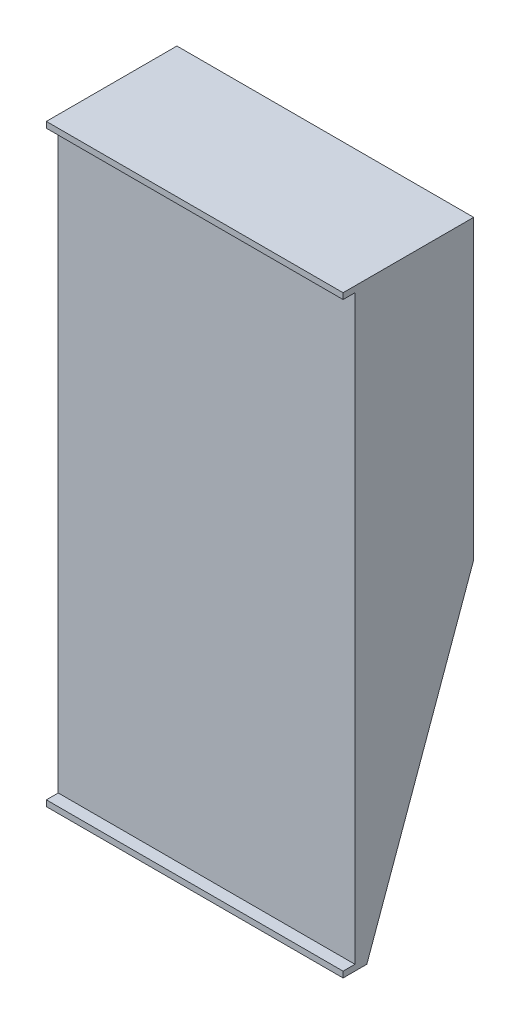
ISO-10303-21;
HEADER;
FILE_DESCRIPTION(('STEP AP214'),'2;1');
FILE_NAME('part.step','',(''),(''),'','','');
FILE_SCHEMA(('AUTOMOTIVE_DESIGN { 1 0 10303 214 1 1 1 1 }'));
ENDSEC;
DATA;
#1=APPLICATION_CONTEXT('core data for automotive mechanical design processes');
#2=APPLICATION_PROTOCOL_DEFINITION('international standard','automotive_design',2000,#1);
#3=PRODUCT_CONTEXT('',#1,'mechanical');
#4=PRODUCT('Part','Part','',(#3));
#5=PRODUCT_RELATED_PRODUCT_CATEGORY('part','',(#4));
#6=PRODUCT_DEFINITION_FORMATION('','',#4);
#7=PRODUCT_DEFINITION_CONTEXT('part definition',#1,'design');
#8=PRODUCT_DEFINITION('design','',#6,#7);
#9=PRODUCT_DEFINITION_SHAPE('','',#8);
#10=(LENGTH_UNIT() NAMED_UNIT(*) SI_UNIT(.MILLI.,.METRE.));
#11=(NAMED_UNIT(*) PLANE_ANGLE_UNIT() SI_UNIT($,.RADIAN.));
#12=(NAMED_UNIT(*) SI_UNIT($,.STERADIAN.) SOLID_ANGLE_UNIT());
#13=UNCERTAINTY_MEASURE_WITH_UNIT(LENGTH_MEASURE(1.E-05),#10,'distance_accuracy_value','');
#14=(GEOMETRIC_REPRESENTATION_CONTEXT(3) GLOBAL_UNCERTAINTY_ASSIGNED_CONTEXT((#13)) GLOBAL_UNIT_ASSIGNED_CONTEXT((#10,
#11,#12)) REPRESENTATION_CONTEXT('',''));
#15=CARTESIAN_POINT('',(0.,0.,0.));
#16=DIRECTION('',(0.,0.,1.));
#17=DIRECTION('',(1.,0.,0.));
#18=AXIS2_PLACEMENT_3D('',#15,#16,#17);
#19=CARTESIAN_POINT('',(0.,0.,2.54));
#20=DIRECTION('',(0.,0.,-1.));
#21=DIRECTION('',(-1.,0.,0.));
#22=AXIS2_PLACEMENT_3D('',#19,#20,#21);
#23=PLANE('',#22);
#24=DIRECTION('',(0.,1.,0.));
#25=VECTOR('',#24,1.);
#26=CARTESIAN_POINT('',(3.175,-6.35,2.54));
#27=LINE('',#26,#25);
#28=CARTESIAN_POINT('',(3.175,-6.223,2.54));
#29=VERTEX_POINT('',#28);
#30=CARTESIAN_POINT('',(3.175,6.223,2.54));
#31=VERTEX_POINT('',#30);
#32=EDGE_CURVE('E56',#29,#31,#27,.T.);
#33=ORIENTED_EDGE('',*,*,#32,.T.);
#34=DIRECTION('',(-1.,0.,0.));
#35=VECTOR('',#34,1.);
#36=CARTESIAN_POINT('',(-3.175,6.223,2.54));
#37=LINE('',#36,#35);
#38=CARTESIAN_POINT('',(-3.175,6.223,2.54));
#39=VERTEX_POINT('',#38);
#40=EDGE_CURVE('E110',#31,#39,#37,.T.);
#41=ORIENTED_EDGE('',*,*,#40,.T.);
#42=DIRECTION('',(0.,-1.,0.));
#43=VECTOR('',#42,1.);
#44=CARTESIAN_POINT('',(-3.175,-6.35,2.54));
#45=LINE('',#44,#43);
#46=CARTESIAN_POINT('',(-3.175,-6.223,2.54));
#47=VERTEX_POINT('',#46);
#48=EDGE_CURVE('E129',#39,#47,#45,.T.);
#49=ORIENTED_EDGE('',*,*,#48,.T.);
#50=DIRECTION('',(-1.,0.,0.));
#51=VECTOR('',#50,1.);
#52=CARTESIAN_POINT('',(-3.175,-6.223,2.54));
#53=LINE('',#52,#51);
#54=EDGE_CURVE('E146',#29,#47,#53,.T.);
#55=ORIENTED_EDGE('',*,*,#54,.F.);
#56=EDGE_LOOP('',(#33,#41,#49,#55));
#57=FACE_BOUND('',#56,.T.);
#58=ADVANCED_FACE('F33',(#57),#23,.F.);
#59=CARTESIAN_POINT('',(3.175,-6.35,2.54));
#60=DIRECTION('',(-1.,0.,0.));
#61=DIRECTION('',(0.,0.,1.));
#62=AXIS2_PLACEMENT_3D('',#59,#60,#61);
#63=PLANE('',#62);
#64=DIRECTION('',(0.,0.,-1.));
#65=VECTOR('',#64,1.);
#66=CARTESIAN_POINT('',(3.175,-6.35,2.54));
#67=LINE('',#66,#65);
#68=CARTESIAN_POINT('',(3.175,-6.35,2.794));
#69=VERTEX_POINT('',#68);
#70=CARTESIAN_POINT('',(3.175,-6.35,2.286));
#71=VERTEX_POINT('',#70);
#72=EDGE_CURVE('E127',#69,#71,#67,.T.);
#73=ORIENTED_EDGE('',*,*,#72,.T.);
#74=DIRECTION('',(0.,-0.940887411868727,0.338719468272742));
#75=VECTOR('',#74,1.);
#76=CARTESIAN_POINT('',(3.175,-6.35,2.286));
#77=LINE('',#76,#75);
#78=CARTESIAN_POINT('',(3.175,0.,0.));
#79=VERTEX_POINT('',#78);
#80=EDGE_CURVE('E106',#79,#71,#77,.T.);
#81=ORIENTED_EDGE('',*,*,#80,.F.);
#82=DIRECTION('',(0.,1.,0.));
#83=VECTOR('',#82,1.);
#84=CARTESIAN_POINT('',(3.175,-6.35,0.));
#85=LINE('',#84,#83);
#86=CARTESIAN_POINT('',(3.175,6.35,0.));
#87=VERTEX_POINT('',#86);
#88=EDGE_CURVE('E135',#79,#87,#85,.T.);
#89=ORIENTED_EDGE('',*,*,#88,.T.);
#90=DIRECTION('',(0.,0.,-1.));
#91=VECTOR('',#90,1.);
#92=CARTESIAN_POINT('',(3.175,6.35,2.54));
#93=LINE('',#92,#91);
#94=CARTESIAN_POINT('',(3.175,6.35,2.794));
#95=VERTEX_POINT('',#94);
#96=EDGE_CURVE('E11',#95,#87,#93,.T.);
#97=ORIENTED_EDGE('',*,*,#96,.F.);
#98=DIRECTION('',(0.,-1.,0.));
#99=VECTOR('',#98,1.);
#100=CARTESIAN_POINT('',(3.175,6.35,2.794));
#101=LINE('',#100,#99);
#102=CARTESIAN_POINT('',(3.175,6.223,2.794));
#103=VERTEX_POINT('',#102);
#104=EDGE_CURVE('E165',#95,#103,#101,.T.);
#105=ORIENTED_EDGE('',*,*,#104,.T.);
#106=DIRECTION('',(0.,0.,-1.));
#107=VECTOR('',#106,1.);
#108=CARTESIAN_POINT('',(3.175,6.223,2.794));
#109=LINE('',#108,#107);
#110=EDGE_CURVE('E158',#103,#31,#109,.T.);
#111=ORIENTED_EDGE('',*,*,#110,.T.);
#112=ORIENTED_EDGE('',*,*,#32,.F.);
#113=DIRECTION('',(0.,0.,-1.));
#114=VECTOR('',#113,1.);
#115=CARTESIAN_POINT('',(3.175,-6.223,2.794));
#116=LINE('',#115,#114);
#117=CARTESIAN_POINT('',(3.175,-6.223,2.794));
#118=VERTEX_POINT('',#117);
#119=EDGE_CURVE('E137',#118,#29,#116,.T.);
#120=ORIENTED_EDGE('',*,*,#119,.F.);
#121=DIRECTION('',(0.,1.,0.));
#122=VECTOR('',#121,1.);
#123=CARTESIAN_POINT('',(3.175,-6.35,2.794));
#124=LINE('',#123,#122);
#125=EDGE_CURVE('E152',#69,#118,#124,.T.);
#126=ORIENTED_EDGE('',*,*,#125,.F.);
#127=EDGE_LOOP('',(#73,#81,#89,#97,#105,#111,#112,#120,#126));
#128=FACE_BOUND('',#127,.T.);
#129=ADVANCED_FACE('F35',(#128),#63,.F.);
#130=CARTESIAN_POINT('',(-3.175,6.35,2.54));
#131=DIRECTION('',(0.,-1.,0.));
#132=DIRECTION('',(0.,0.,-1.));
#133=AXIS2_PLACEMENT_3D('',#130,#131,#132);
#134=PLANE('',#133);
#135=DIRECTION('',(-1.,0.,0.));
#136=VECTOR('',#135,1.);
#137=CARTESIAN_POINT('',(-3.175,6.35,0.));
#138=LINE('',#137,#136);
#139=CARTESIAN_POINT('',(-3.175,6.35,0.));
#140=VERTEX_POINT('',#139);
#141=EDGE_CURVE('E133',#87,#140,#138,.T.);
#142=ORIENTED_EDGE('',*,*,#141,.T.);
#143=DIRECTION('',(0.,0.,-1.));
#144=VECTOR('',#143,1.);
#145=CARTESIAN_POINT('',(-3.175,6.35,2.54));
#146=LINE('',#145,#144);
#147=CARTESIAN_POINT('',(-3.175,6.35,2.794));
#148=VERTEX_POINT('',#147);
#149=EDGE_CURVE('E41',#148,#140,#146,.T.);
#150=ORIENTED_EDGE('',*,*,#149,.F.);
#151=DIRECTION('',(1.,0.,0.));
#152=VECTOR('',#151,1.);
#153=CARTESIAN_POINT('',(-3.175,6.35,2.794));
#154=LINE('',#153,#152);
#155=EDGE_CURVE('E160',#148,#95,#154,.T.);
#156=ORIENTED_EDGE('',*,*,#155,.T.);
#157=ORIENTED_EDGE('',*,*,#96,.T.);
#158=EDGE_LOOP('',(#142,#150,#156,#157));
#159=FACE_BOUND('',#158,.T.);
#160=ADVANCED_FACE('F181',(#159),#134,.F.);
#161=CARTESIAN_POINT('',(-3.175,-6.35,2.54));
#162=DIRECTION('',(1.,0.,0.));
#163=DIRECTION('',(0.,0.,-1.));
#164=AXIS2_PLACEMENT_3D('',#161,#162,#163);
#165=PLANE('',#164);
#166=DIRECTION('',(0.,-1.,0.));
#167=VECTOR('',#166,1.);
#168=CARTESIAN_POINT('',(-3.175,-6.35,0.));
#169=LINE('',#168,#167);
#170=CARTESIAN_POINT('',(-3.175,0.,0.));
#171=VERTEX_POINT('',#170);
#172=EDGE_CURVE('E121',#140,#171,#169,.T.);
#173=ORIENTED_EDGE('',*,*,#172,.T.);
#174=DIRECTION('',(0.,-0.940887411868727,0.338719468272742));
#175=VECTOR('',#174,1.);
#176=CARTESIAN_POINT('',(-3.175,-6.35,2.286));
#177=LINE('',#176,#175);
#178=CARTESIAN_POINT('',(-3.175,-6.35,2.286));
#179=VERTEX_POINT('',#178);
#180=EDGE_CURVE('E48',#171,#179,#177,.T.);
#181=ORIENTED_EDGE('',*,*,#180,.T.);
#182=DIRECTION('',(0.,0.,-1.));
#183=VECTOR('',#182,1.);
#184=CARTESIAN_POINT('',(-3.175,-6.35,2.54));
#185=LINE('',#184,#183);
#186=CARTESIAN_POINT('',(-3.175,-6.35,2.794));
#187=VERTEX_POINT('',#186);
#188=EDGE_CURVE('E117',#187,#179,#185,.T.);
#189=ORIENTED_EDGE('',*,*,#188,.F.);
#190=DIRECTION('',(0.,-1.,0.));
#191=VECTOR('',#190,1.);
#192=CARTESIAN_POINT('',(-3.175,-6.35,2.794));
#193=LINE('',#192,#191);
#194=CARTESIAN_POINT('',(-3.175,-6.223,2.794));
#195=VERTEX_POINT('',#194);
#196=EDGE_CURVE('E149',#195,#187,#193,.T.);
#197=ORIENTED_EDGE('',*,*,#196,.F.);
#198=DIRECTION('',(0.,0.,-1.));
#199=VECTOR('',#198,1.);
#200=CARTESIAN_POINT('',(-3.175,-6.223,2.794));
#201=LINE('',#200,#199);
#202=EDGE_CURVE('E142',#195,#47,#201,.T.);
#203=ORIENTED_EDGE('',*,*,#202,.T.);
#204=ORIENTED_EDGE('',*,*,#48,.F.);
#205=DIRECTION('',(0.,0.,-1.));
#206=VECTOR('',#205,1.);
#207=CARTESIAN_POINT('',(-3.175,6.223,2.794));
#208=LINE('',#207,#206);
#209=CARTESIAN_POINT('',(-3.175,6.223,2.794));
#210=VERTEX_POINT('',#209);
#211=EDGE_CURVE('E150',#210,#39,#208,.T.);
#212=ORIENTED_EDGE('',*,*,#211,.F.);
#213=DIRECTION('',(0.,1.,0.));
#214=VECTOR('',#213,1.);
#215=CARTESIAN_POINT('',(-3.175,6.35,2.794));
#216=LINE('',#215,#214);
#217=EDGE_CURVE('E162',#210,#148,#216,.T.);
#218=ORIENTED_EDGE('',*,*,#217,.T.);
#219=ORIENTED_EDGE('',*,*,#149,.T.);
#220=EDGE_LOOP('',(#173,#181,#189,#197,#203,#204,#212,#218,#219));
#221=FACE_BOUND('',#220,.T.);
#222=ADVANCED_FACE('F115',(#221),#165,.F.);
#223=CARTESIAN_POINT('',(-3.175,-6.35,2.54));
#224=DIRECTION('',(0.,1.,0.));
#225=DIRECTION('',(0.,0.,1.));
#226=AXIS2_PLACEMENT_3D('',#223,#224,#225);
#227=PLANE('',#226);
#228=ORIENTED_EDGE('',*,*,#188,.T.);
#229=DIRECTION('',(1.,0.,0.));
#230=VECTOR('',#229,1.);
#231=CARTESIAN_POINT('',(-3.175,-6.35,2.286));
#232=LINE('',#231,#230);
#233=EDGE_CURVE('E103',#179,#71,#232,.T.);
#234=ORIENTED_EDGE('',*,*,#233,.T.);
#235=ORIENTED_EDGE('',*,*,#72,.F.);
#236=DIRECTION('',(1.,0.,0.));
#237=VECTOR('',#236,1.);
#238=CARTESIAN_POINT('',(-3.175,-6.35,2.794));
#239=LINE('',#238,#237);
#240=EDGE_CURVE('E125',#187,#69,#239,.T.);
#241=ORIENTED_EDGE('',*,*,#240,.F.);
#242=EDGE_LOOP('',(#228,#234,#235,#241));
#243=FACE_BOUND('',#242,.T.);
#244=ADVANCED_FACE('F123',(#243),#227,.F.);
#245=CARTESIAN_POINT('',(0.,0.,0.));
#246=DIRECTION('',(0.,0.,-1.));
#247=DIRECTION('',(-1.,0.,0.));
#248=AXIS2_PLACEMENT_3D('',#245,#246,#247);
#249=PLANE('',#248);
#250=DIRECTION('',(1.,0.,0.));
#251=VECTOR('',#250,1.);
#252=CARTESIAN_POINT('',(-3.175,0.,0.));
#253=LINE('',#252,#251);
#254=EDGE_CURVE('E111',#171,#79,#253,.T.);
#255=ORIENTED_EDGE('',*,*,#254,.F.);
#256=ORIENTED_EDGE('',*,*,#172,.F.);
#257=ORIENTED_EDGE('',*,*,#141,.F.);
#258=ORIENTED_EDGE('',*,*,#88,.F.);
#259=EDGE_LOOP('',(#255,#256,#257,#258));
#260=FACE_BOUND('',#259,.T.);
#261=ADVANCED_FACE('F179',(#260),#249,.T.);
#262=CARTESIAN_POINT('',(-3.175,-6.223,2.794));
#263=DIRECTION('',(0.,-1.,0.));
#264=DIRECTION('',(0.,0.,-1.));
#265=AXIS2_PLACEMENT_3D('',#262,#263,#264);
#266=PLANE('',#265);
#267=ORIENTED_EDGE('',*,*,#54,.T.);
#268=ORIENTED_EDGE('',*,*,#202,.F.);
#269=DIRECTION('',(-1.,0.,0.));
#270=VECTOR('',#269,1.);
#271=CARTESIAN_POINT('',(-3.175,-6.223,2.794));
#272=LINE('',#271,#270);
#273=EDGE_CURVE('E145',#118,#195,#272,.T.);
#274=ORIENTED_EDGE('',*,*,#273,.F.);
#275=ORIENTED_EDGE('',*,*,#119,.T.);
#276=EDGE_LOOP('',(#267,#268,#274,#275));
#277=FACE_BOUND('',#276,.T.);
#278=ADVANCED_FACE('F194',(#277),#266,.F.);
#279=CARTESIAN_POINT('',(0.,0.,2.794));
#280=DIRECTION('',(0.,0.,-1.));
#281=DIRECTION('',(-1.,0.,0.));
#282=AXIS2_PLACEMENT_3D('',#279,#280,#281);
#283=PLANE('',#282);
#284=ORIENTED_EDGE('',*,*,#196,.T.);
#285=ORIENTED_EDGE('',*,*,#240,.T.);
#286=ORIENTED_EDGE('',*,*,#125,.T.);
#287=ORIENTED_EDGE('',*,*,#273,.T.);
#288=EDGE_LOOP('',(#284,#285,#286,#287));
#289=FACE_BOUND('',#288,.T.);
#290=ADVANCED_FACE('F197',(#289),#283,.F.);
#291=CARTESIAN_POINT('',(-3.175,6.223,2.794));
#292=DIRECTION('',(0.,-1.,0.));
#293=DIRECTION('',(0.,0.,-1.));
#294=AXIS2_PLACEMENT_3D('',#291,#292,#293);
#295=PLANE('',#294);
#296=ORIENTED_EDGE('',*,*,#40,.F.);
#297=ORIENTED_EDGE('',*,*,#110,.F.);
#298=DIRECTION('',(-1.,0.,0.));
#299=VECTOR('',#298,1.);
#300=CARTESIAN_POINT('',(-3.175,6.223,2.794));
#301=LINE('',#300,#299);
#302=EDGE_CURVE('E168',#103,#210,#301,.T.);
#303=ORIENTED_EDGE('',*,*,#302,.T.);
#304=ORIENTED_EDGE('',*,*,#211,.T.);
#305=EDGE_LOOP('',(#296,#297,#303,#304));
#306=FACE_BOUND('',#305,.T.);
#307=ADVANCED_FACE('F190',(#306),#295,.T.);
#308=CARTESIAN_POINT('',(0.,0.,2.794));
#309=DIRECTION('',(0.,0.,-1.));
#310=DIRECTION('',(-1.,0.,0.));
#311=AXIS2_PLACEMENT_3D('',#308,#309,#310);
#312=PLANE('',#311);
#313=ORIENTED_EDGE('',*,*,#217,.F.);
#314=ORIENTED_EDGE('',*,*,#302,.F.);
#315=ORIENTED_EDGE('',*,*,#104,.F.);
#316=ORIENTED_EDGE('',*,*,#155,.F.);
#317=EDGE_LOOP('',(#313,#314,#315,#316));
#318=FACE_BOUND('',#317,.T.);
#319=ADVANCED_FACE('F187',(#318),#312,.F.);
#320=CARTESIAN_POINT('',(-3.175,-6.35,2.286));
#321=DIRECTION('',(0.,0.338719468272742,0.940887411868727));
#322=DIRECTION('',(0.,-0.940887411868727,0.338719468272742));
#323=AXIS2_PLACEMENT_3D('',#320,#321,#322);
#324=PLANE('',#323);
#325=ORIENTED_EDGE('',*,*,#80,.T.);
#326=ORIENTED_EDGE('',*,*,#233,.F.);
#327=ORIENTED_EDGE('',*,*,#180,.F.);
#328=ORIENTED_EDGE('',*,*,#254,.T.);
#329=EDGE_LOOP('',(#325,#326,#327,#328));
#330=FACE_BOUND('',#329,.T.);
#331=ADVANCED_FACE('F104',(#330),#324,.F.);
#332=CLOSED_SHELL('',(#58,#129,#160,#222,#244,#261,#278,#290,#307,#319,#331));
#333=MANIFOLD_SOLID_BREP('B2',#332);
#334=ADVANCED_BREP_SHAPE_REPRESENTATION('',(#18,#333),#14);
#335=SHAPE_DEFINITION_REPRESENTATION(#9,#334);
ENDSEC;
END-ISO-10303-21;
